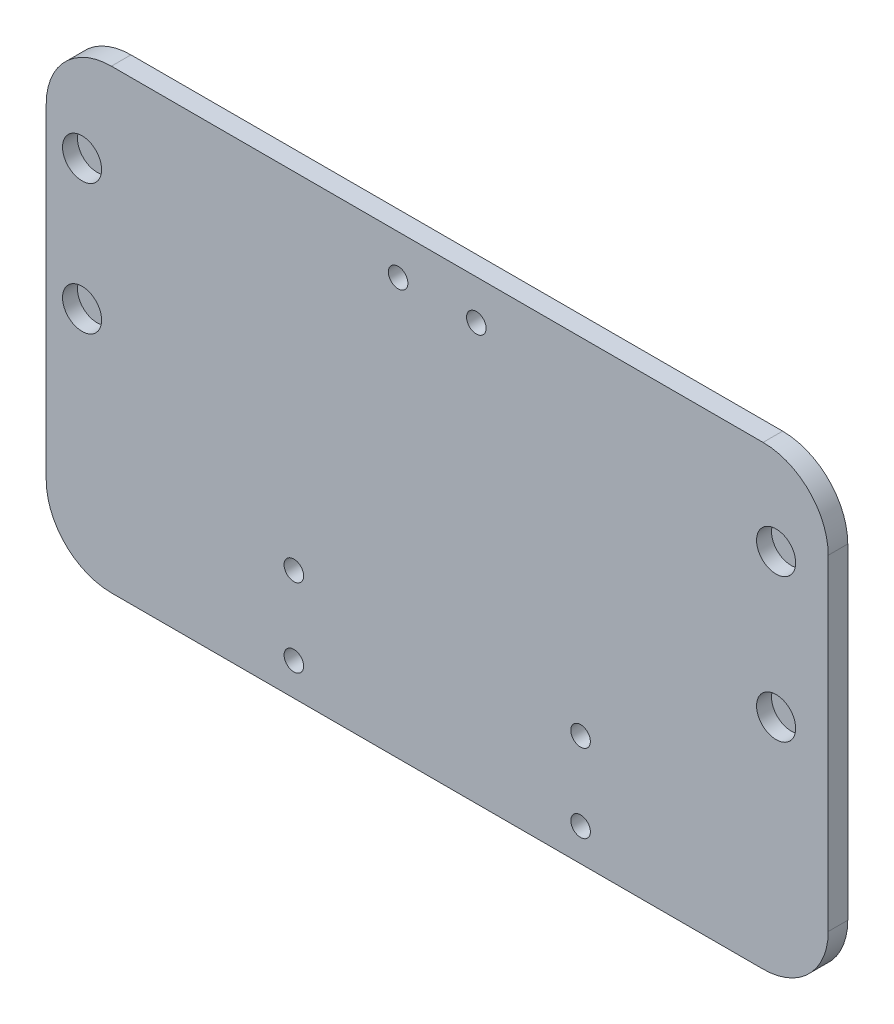
ISO-10303-21;
HEADER;
FILE_DESCRIPTION(('STEP AP214'),'2;1');
FILE_NAME('part.step','',(''),(''),'','','');
FILE_SCHEMA(('AUTOMOTIVE_DESIGN { 1 0 10303 214 1 1 1 1 }'));
ENDSEC;
DATA;
#1=APPLICATION_CONTEXT('core data for automotive mechanical design processes');
#2=APPLICATION_PROTOCOL_DEFINITION('international standard','automotive_design',2000,#1);
#3=PRODUCT_CONTEXT('',#1,'mechanical');
#4=PRODUCT('Part','Part','',(#3));
#5=PRODUCT_RELATED_PRODUCT_CATEGORY('part','',(#4));
#6=PRODUCT_DEFINITION_FORMATION('','',#4);
#7=PRODUCT_DEFINITION_CONTEXT('part definition',#1,'design');
#8=PRODUCT_DEFINITION('design','',#6,#7);
#9=PRODUCT_DEFINITION_SHAPE('','',#8);
#10=(LENGTH_UNIT() NAMED_UNIT(*) SI_UNIT(.MILLI.,.METRE.));
#11=(NAMED_UNIT(*) PLANE_ANGLE_UNIT() SI_UNIT($,.RADIAN.));
#12=(NAMED_UNIT(*) SI_UNIT($,.STERADIAN.) SOLID_ANGLE_UNIT());
#13=UNCERTAINTY_MEASURE_WITH_UNIT(LENGTH_MEASURE(1.E-05),#10,'distance_accuracy_value','');
#14=(GEOMETRIC_REPRESENTATION_CONTEXT(3) GLOBAL_UNCERTAINTY_ASSIGNED_CONTEXT((#13)) GLOBAL_UNIT_ASSIGNED_CONTEXT((#10,
#11,#12)) REPRESENTATION_CONTEXT('',''));
#15=CARTESIAN_POINT('',(0.,0.,0.));
#16=DIRECTION('',(0.,0.,1.));
#17=DIRECTION('',(1.,0.,0.));
#18=AXIS2_PLACEMENT_3D('',#15,#16,#17);
#19=CARTESIAN_POINT('',(1.54506437768241,27.7038626609442,3.));
#20=DIRECTION('',(0.,0.,-1.));
#21=DIRECTION('',(-1.,0.,0.));
#22=AXIS2_PLACEMENT_3D('',#19,#20,#21);
#23=CYLINDRICAL_SURFACE('',#22,10.);
#24=CARTESIAN_POINT('',(1.54506437768241,27.7038626609442,0.));
#25=DIRECTION('',(0.,0.,1.));
#26=DIRECTION('',(-1.,0.,0.));
#27=AXIS2_PLACEMENT_3D('',#24,#25,#26);
#28=CIRCLE('',#27,10.);
#29=CARTESIAN_POINT('',(11.5450643776824,27.7038626609442,0.));
#30=VERTEX_POINT('',#29);
#31=CARTESIAN_POINT('',(1.54506437768241,37.7038626609442,0.));
#32=VERTEX_POINT('',#31);
#33=EDGE_CURVE('E129',#30,#32,#28,.T.);
#34=ORIENTED_EDGE('',*,*,#33,.T.);
#35=DIRECTION('',(0.,0.,-1.));
#36=VECTOR('',#35,1.);
#37=CARTESIAN_POINT('',(1.54506437768241,37.7038626609442,3.));
#38=LINE('',#37,#36);
#39=CARTESIAN_POINT('',(1.54506437768241,37.7038626609442,3.));
#40=VERTEX_POINT('',#39);
#41=EDGE_CURVE('E11',#40,#32,#38,.T.);
#42=ORIENTED_EDGE('',*,*,#41,.F.);
#43=CARTESIAN_POINT('',(1.54506437768241,27.7038626609442,3.));
#44=DIRECTION('',(0.,0.,1.));
#45=DIRECTION('',(-1.,0.,0.));
#46=AXIS2_PLACEMENT_3D('',#43,#44,#45);
#47=CIRCLE('',#46,10.);
#48=CARTESIAN_POINT('',(11.5450643776824,27.7038626609442,3.));
#49=VERTEX_POINT('',#48);
#50=EDGE_CURVE('E144',#49,#40,#47,.T.);
#51=ORIENTED_EDGE('',*,*,#50,.F.);
#52=DIRECTION('',(0.,0.,-1.));
#53=VECTOR('',#52,1.);
#54=CARTESIAN_POINT('',(11.5450643776824,27.7038626609442,3.));
#55=LINE('',#54,#53);
#56=EDGE_CURVE('E125',#49,#30,#55,.T.);
#57=ORIENTED_EDGE('',*,*,#56,.T.);
#58=EDGE_LOOP('',(#34,#42,#51,#57));
#59=FACE_BOUND('',#58,.T.);
#60=ADVANCED_FACE('F33',(#59),#23,.T.);
#61=CARTESIAN_POINT('',(-98.4549356223175,37.7038626609442,3.));
#62=DIRECTION('',(0.,-1.,0.));
#63=DIRECTION('',(1.,0.,0.));
#64=AXIS2_PLACEMENT_3D('',#61,#62,#63);
#65=PLANE('',#64);
#66=DIRECTION('',(-1.,0.,0.));
#67=VECTOR('',#66,1.);
#68=CARTESIAN_POINT('',(-98.4549356223175,37.7038626609442,0.));
#69=LINE('',#68,#67);
#70=CARTESIAN_POINT('',(-98.4549356223175,37.7038626609442,0.));
#71=VERTEX_POINT('',#70);
#72=EDGE_CURVE('E132',#32,#71,#69,.T.);
#73=ORIENTED_EDGE('',*,*,#72,.T.);
#74=DIRECTION('',(0.,0.,-1.));
#75=VECTOR('',#74,1.);
#76=CARTESIAN_POINT('',(-98.4549356223175,37.7038626609442,3.));
#77=LINE('',#76,#75);
#78=CARTESIAN_POINT('',(-98.4549356223175,37.7038626609442,3.));
#79=VERTEX_POINT('',#78);
#80=EDGE_CURVE('E41',#79,#71,#77,.T.);
#81=ORIENTED_EDGE('',*,*,#80,.F.);
#82=DIRECTION('',(-1.,0.,0.));
#83=VECTOR('',#82,1.);
#84=CARTESIAN_POINT('',(-98.4549356223175,37.7038626609442,3.));
#85=LINE('',#84,#83);
#86=EDGE_CURVE('E92',#40,#79,#85,.T.);
#87=ORIENTED_EDGE('',*,*,#86,.F.);
#88=ORIENTED_EDGE('',*,*,#41,.T.);
#89=EDGE_LOOP('',(#73,#81,#87,#88));
#90=FACE_BOUND('',#89,.T.);
#91=ADVANCED_FACE('F282',(#90),#65,.F.);
#92=CARTESIAN_POINT('',(-98.4549356223176,27.7038626609442,3.));
#93=DIRECTION('',(0.,0.,-1.));
#94=DIRECTION('',(-1.,0.,0.));
#95=AXIS2_PLACEMENT_3D('',#92,#93,#94);
#96=CYLINDRICAL_SURFACE('',#95,10.);
#97=CARTESIAN_POINT('',(-98.4549356223176,27.7038626609442,0.));
#98=DIRECTION('',(0.,0.,1.));
#99=DIRECTION('',(1.,0.,0.));
#100=AXIS2_PLACEMENT_3D('',#97,#98,#99);
#101=CIRCLE('',#100,10.);
#102=CARTESIAN_POINT('',(-108.454935622318,27.7038626609441,0.));
#103=VERTEX_POINT('',#102);
#104=EDGE_CURVE('E135',#71,#103,#101,.T.);
#105=ORIENTED_EDGE('',*,*,#104,.T.);
#106=DIRECTION('',(0.,0.,-1.));
#107=VECTOR('',#106,1.);
#108=CARTESIAN_POINT('',(-108.454935622318,27.7038626609441,3.));
#109=LINE('',#108,#107);
#110=CARTESIAN_POINT('',(-108.454935622318,27.7038626609441,3.));
#111=VERTEX_POINT('',#110);
#112=EDGE_CURVE('E151',#111,#103,#109,.T.);
#113=ORIENTED_EDGE('',*,*,#112,.F.);
#114=CARTESIAN_POINT('',(-98.4549356223176,27.7038626609442,3.));
#115=DIRECTION('',(0.,0.,1.));
#116=DIRECTION('',(1.,0.,0.));
#117=AXIS2_PLACEMENT_3D('',#114,#115,#116);
#118=CIRCLE('',#117,10.);
#119=EDGE_CURVE('E159',#79,#111,#118,.T.);
#120=ORIENTED_EDGE('',*,*,#119,.F.);
#121=ORIENTED_EDGE('',*,*,#80,.T.);
#122=EDGE_LOOP('',(#105,#113,#120,#121));
#123=FACE_BOUND('',#122,.T.);
#124=ADVANCED_FACE('F157',(#123),#96,.T.);
#125=CARTESIAN_POINT('',(-108.454935622318,27.7038626609441,3.));
#126=DIRECTION('',(1.,0.,0.));
#127=DIRECTION('',(0.,0.,-1.));
#128=AXIS2_PLACEMENT_3D('',#125,#126,#127);
#129=PLANE('',#128);
#130=DIRECTION('',(0.,-1.,0.));
#131=VECTOR('',#130,1.);
#132=CARTESIAN_POINT('',(-108.454935622318,27.7038626609441,0.));
#133=LINE('',#132,#131);
#134=CARTESIAN_POINT('',(-108.454935622318,-22.2961373390557,0.));
#135=VERTEX_POINT('',#134);
#136=EDGE_CURVE('E137',#103,#135,#133,.T.);
#137=ORIENTED_EDGE('',*,*,#136,.T.);
#138=DIRECTION('',(0.,0.,-1.));
#139=VECTOR('',#138,1.);
#140=CARTESIAN_POINT('',(-108.454935622318,-22.2961373390557,3.));
#141=LINE('',#140,#139);
#142=CARTESIAN_POINT('',(-108.454935622318,-22.2961373390557,3.));
#143=VERTEX_POINT('',#142);
#144=EDGE_CURVE('E148',#143,#135,#141,.T.);
#145=ORIENTED_EDGE('',*,*,#144,.F.);
#146=DIRECTION('',(0.,-1.,0.));
#147=VECTOR('',#146,1.);
#148=CARTESIAN_POINT('',(-108.454935622318,27.7038626609441,3.));
#149=LINE('',#148,#147);
#150=EDGE_CURVE('E171',#111,#143,#149,.T.);
#151=ORIENTED_EDGE('',*,*,#150,.F.);
#152=ORIENTED_EDGE('',*,*,#112,.T.);
#153=EDGE_LOOP('',(#137,#145,#151,#152));
#154=FACE_BOUND('',#153,.T.);
#155=ADVANCED_FACE('F167',(#154),#129,.F.);
#156=CARTESIAN_POINT('',(-98.4549356223176,-22.2961373390558,3.));
#157=DIRECTION('',(0.,0.,-1.));
#158=DIRECTION('',(-1.,0.,0.));
#159=AXIS2_PLACEMENT_3D('',#156,#157,#158);
#160=CYLINDRICAL_SURFACE('',#159,10.);
#161=CARTESIAN_POINT('',(-98.4549356223176,-22.2961373390558,0.));
#162=DIRECTION('',(0.,0.,1.));
#163=DIRECTION('',(1.,0.,0.));
#164=AXIS2_PLACEMENT_3D('',#161,#162,#163);
#165=CIRCLE('',#164,10.);
#166=CARTESIAN_POINT('',(-98.4549356223175,-32.2961373390558,0.));
#167=VERTEX_POINT('',#166);
#168=EDGE_CURVE('E139',#135,#167,#165,.T.);
#169=ORIENTED_EDGE('',*,*,#168,.T.);
#170=DIRECTION('',(0.,0.,-1.));
#171=VECTOR('',#170,1.);
#172=CARTESIAN_POINT('',(-98.4549356223175,-32.2961373390558,3.));
#173=LINE('',#172,#171);
#174=CARTESIAN_POINT('',(-98.4549356223175,-32.2961373390558,3.));
#175=VERTEX_POINT('',#174);
#176=EDGE_CURVE('E120',#175,#167,#173,.T.);
#177=ORIENTED_EDGE('',*,*,#176,.F.);
#178=CARTESIAN_POINT('',(-98.4549356223176,-22.2961373390558,3.));
#179=DIRECTION('',(0.,0.,1.));
#180=DIRECTION('',(1.,0.,0.));
#181=AXIS2_PLACEMENT_3D('',#178,#179,#180);
#182=CIRCLE('',#181,10.);
#183=EDGE_CURVE('E111',#143,#175,#182,.T.);
#184=ORIENTED_EDGE('',*,*,#183,.F.);
#185=ORIENTED_EDGE('',*,*,#144,.T.);
#186=EDGE_LOOP('',(#169,#177,#184,#185));
#187=FACE_BOUND('',#186,.T.);
#188=ADVANCED_FACE('F170',(#187),#160,.T.);
#189=CARTESIAN_POINT('',(-98.4549356223175,-32.2961373390558,3.));
#190=DIRECTION('',(0.,1.,0.));
#191=DIRECTION('',(0.,0.,1.));
#192=AXIS2_PLACEMENT_3D('',#189,#190,#191);
#193=PLANE('',#192);
#194=DIRECTION('',(1.,0.,0.));
#195=VECTOR('',#194,1.);
#196=CARTESIAN_POINT('',(-98.4549356223175,-32.2961373390558,0.));
#197=LINE('',#196,#195);
#198=CARTESIAN_POINT('',(1.54506437768241,-32.2961373390558,0.));
#199=VERTEX_POINT('',#198);
#200=EDGE_CURVE('E119',#167,#199,#197,.T.);
#201=ORIENTED_EDGE('',*,*,#200,.T.);
#202=DIRECTION('',(0.,0.,-1.));
#203=VECTOR('',#202,1.);
#204=CARTESIAN_POINT('',(1.54506437768241,-32.2961373390558,3.));
#205=LINE('',#204,#203);
#206=CARTESIAN_POINT('',(1.54506437768241,-32.2961373390558,3.));
#207=VERTEX_POINT('',#206);
#208=EDGE_CURVE('E116',#207,#199,#205,.T.);
#209=ORIENTED_EDGE('',*,*,#208,.F.);
#210=DIRECTION('',(1.,0.,0.));
#211=VECTOR('',#210,1.);
#212=CARTESIAN_POINT('',(-98.4549356223175,-32.2961373390558,3.));
#213=LINE('',#212,#211);
#214=EDGE_CURVE('E105',#175,#207,#213,.T.);
#215=ORIENTED_EDGE('',*,*,#214,.F.);
#216=ORIENTED_EDGE('',*,*,#176,.T.);
#217=EDGE_LOOP('',(#201,#209,#215,#216));
#218=FACE_BOUND('',#217,.T.);
#219=ADVANCED_FACE('F117',(#218),#193,.F.);
#220=CARTESIAN_POINT('',(1.54506437768241,-22.2961373390558,3.));
#221=DIRECTION('',(0.,0.,-1.));
#222=DIRECTION('',(-1.,0.,0.));
#223=AXIS2_PLACEMENT_3D('',#220,#221,#222);
#224=CYLINDRICAL_SURFACE('',#223,10.);
#225=CARTESIAN_POINT('',(1.54506437768241,-22.2961373390558,0.));
#226=DIRECTION('',(0.,0.,1.));
#227=DIRECTION('',(1.,0.,0.));
#228=AXIS2_PLACEMENT_3D('',#225,#226,#227);
#229=CIRCLE('',#228,10.);
#230=CARTESIAN_POINT('',(11.5450643776824,-22.2961373390558,0.));
#231=VERTEX_POINT('',#230);
#232=EDGE_CURVE('E78',#199,#231,#229,.T.);
#233=ORIENTED_EDGE('',*,*,#232,.T.);
#234=DIRECTION('',(0.,0.,-1.));
#235=VECTOR('',#234,1.);
#236=CARTESIAN_POINT('',(11.5450643776824,-22.2961373390558,3.));
#237=LINE('',#236,#235);
#238=CARTESIAN_POINT('',(11.5450643776824,-22.2961373390558,3.));
#239=VERTEX_POINT('',#238);
#240=EDGE_CURVE('E121',#239,#231,#237,.T.);
#241=ORIENTED_EDGE('',*,*,#240,.F.);
#242=CARTESIAN_POINT('',(1.54506437768241,-22.2961373390558,3.));
#243=DIRECTION('',(0.,0.,1.));
#244=DIRECTION('',(1.,0.,0.));
#245=AXIS2_PLACEMENT_3D('',#242,#243,#244);
#246=CIRCLE('',#245,10.);
#247=EDGE_CURVE('E109',#207,#239,#246,.T.);
#248=ORIENTED_EDGE('',*,*,#247,.F.);
#249=ORIENTED_EDGE('',*,*,#208,.T.);
#250=EDGE_LOOP('',(#233,#241,#248,#249));
#251=FACE_BOUND('',#250,.T.);
#252=ADVANCED_FACE('F123',(#251),#224,.T.);
#253=CARTESIAN_POINT('',(11.5450643776824,27.7038626609442,3.));
#254=DIRECTION('',(-1.,0.,0.));
#255=DIRECTION('',(0.,-1.,0.));
#256=AXIS2_PLACEMENT_3D('',#253,#254,#255);
#257=PLANE('',#256);
#258=DIRECTION('',(0.,1.,0.));
#259=VECTOR('',#258,1.);
#260=CARTESIAN_POINT('',(11.5450643776824,27.7038626609442,0.));
#261=LINE('',#260,#259);
#262=EDGE_CURVE('E84',#231,#30,#261,.T.);
#263=ORIENTED_EDGE('',*,*,#262,.T.);
#264=ORIENTED_EDGE('',*,*,#56,.F.);
#265=DIRECTION('',(0.,1.,0.));
#266=VECTOR('',#265,1.);
#267=CARTESIAN_POINT('',(11.5450643776824,27.7038626609442,3.));
#268=LINE('',#267,#266);
#269=EDGE_CURVE('E49',#239,#49,#268,.T.);
#270=ORIENTED_EDGE('',*,*,#269,.F.);
#271=ORIENTED_EDGE('',*,*,#240,.T.);
#272=EDGE_LOOP('',(#263,#264,#270,#271));
#273=FACE_BOUND('',#272,.T.);
#274=ADVANCED_FACE('F248',(#273),#257,.F.);
#275=CARTESIAN_POINT('',(1.54506437768241,27.7038626609442,3.));
#276=DIRECTION('',(0.,0.,-1.));
#277=DIRECTION('',(-1.,0.,0.));
#278=AXIS2_PLACEMENT_3D('',#275,#276,#277);
#279=PLANE('',#278);
#280=CARTESIAN_POINT('',(-102.954935622318,3.20386266094422,3.));
#281=DIRECTION('',(0.,0.,1.));
#282=DIRECTION('',(1.,0.,0.));
#283=AXIS2_PLACEMENT_3D('',#280,#281,#282);
#284=CIRCLE('',#283,3.00000000000001);
#285=CARTESIAN_POINT('',(-99.9549356223176,3.20386266094422,3.));
#286=VERTEX_POINT('',#285);
#287=EDGE_CURVE('E226',#286,#286,#284,.T.);
#288=ORIENTED_EDGE('',*,*,#287,.F.);
#289=EDGE_LOOP('',(#288));
#290=FACE_BOUND('',#289,.T.);
#291=CARTESIAN_POINT('',(3.54506437768241,24.2038626609442,3.));
#292=DIRECTION('',(0.,0.,1.));
#293=DIRECTION('',(1.,0.,0.));
#294=AXIS2_PLACEMENT_3D('',#291,#292,#293);
#295=CIRCLE('',#294,3.);
#296=CARTESIAN_POINT('',(6.54506437768242,24.2038626609442,3.));
#297=VERTEX_POINT('',#296);
#298=EDGE_CURVE('E219',#297,#297,#295,.T.);
#299=ORIENTED_EDGE('',*,*,#298,.F.);
#300=EDGE_LOOP('',(#299));
#301=FACE_BOUND('',#300,.T.);
#302=CARTESIAN_POINT('',(3.54506437768241,2.20386266094422,3.));
#303=DIRECTION('',(0.,0.,1.));
#304=DIRECTION('',(1.,0.,0.));
#305=AXIS2_PLACEMENT_3D('',#302,#303,#304);
#306=CIRCLE('',#305,3.);
#307=CARTESIAN_POINT('',(6.54506437768242,2.20386266094422,3.));
#308=VERTEX_POINT('',#307);
#309=EDGE_CURVE('E231',#308,#308,#306,.T.);
#310=ORIENTED_EDGE('',*,*,#309,.F.);
#311=EDGE_LOOP('',(#310));
#312=FACE_BOUND('',#311,.T.);
#313=CARTESIAN_POINT('',(-102.954935622318,23.2038626609442,3.));
#314=DIRECTION('',(0.,0.,1.));
#315=DIRECTION('',(1.,0.,0.));
#316=AXIS2_PLACEMENT_3D('',#313,#314,#315);
#317=CIRCLE('',#316,3.00000000000001);
#318=CARTESIAN_POINT('',(-99.9549356223176,23.2038626609442,3.));
#319=VERTEX_POINT('',#318);
#320=EDGE_CURVE('E213',#319,#319,#317,.T.);
#321=ORIENTED_EDGE('',*,*,#320,.F.);
#322=EDGE_LOOP('',(#321));
#323=FACE_BOUND('',#322,.T.);
#324=CARTESIAN_POINT('',(-26.4549356223176,-15.2961373390558,3.));
#325=DIRECTION('',(0.,0.,1.));
#326=DIRECTION('',(1.,0.,0.));
#327=AXIS2_PLACEMENT_3D('',#324,#325,#326);
#328=CIRCLE('',#327,1.5);
#329=CARTESIAN_POINT('',(-24.9549356223176,-15.2961373390558,3.));
#330=VERTEX_POINT('',#329);
#331=EDGE_CURVE('E195',#330,#330,#328,.T.);
#332=ORIENTED_EDGE('',*,*,#331,.F.);
#333=EDGE_LOOP('',(#332));
#334=FACE_BOUND('',#333,.T.);
#335=CARTESIAN_POINT('',(-70.4549356223176,-27.2961373390558,3.));
#336=DIRECTION('',(0.,0.,1.));
#337=DIRECTION('',(1.,0.,0.));
#338=AXIS2_PLACEMENT_3D('',#335,#336,#337);
#339=CIRCLE('',#338,1.5);
#340=CARTESIAN_POINT('',(-68.9549356223176,-27.2961373390558,3.));
#341=VERTEX_POINT('',#340);
#342=EDGE_CURVE('E202',#341,#341,#339,.T.);
#343=ORIENTED_EDGE('',*,*,#342,.F.);
#344=EDGE_LOOP('',(#343));
#345=FACE_BOUND('',#344,.T.);
#346=CARTESIAN_POINT('',(-70.4549356223176,-15.2961373390558,3.));
#347=DIRECTION('',(0.,0.,1.));
#348=DIRECTION('',(1.,0.,0.));
#349=AXIS2_PLACEMENT_3D('',#346,#347,#348);
#350=CIRCLE('',#349,1.5);
#351=CARTESIAN_POINT('',(-68.9549356223176,-15.2961373390558,3.));
#352=VERTEX_POINT('',#351);
#353=EDGE_CURVE('E183',#352,#352,#350,.T.);
#354=ORIENTED_EDGE('',*,*,#353,.F.);
#355=EDGE_LOOP('',(#354));
#356=FACE_BOUND('',#355,.T.);
#357=CARTESIAN_POINT('',(-42.4549356223176,31.6065740698624,3.));
#358=DIRECTION('',(0.,0.,1.));
#359=DIRECTION('',(1.,0.,0.));
#360=AXIS2_PLACEMENT_3D('',#357,#358,#359);
#361=CIRCLE('',#360,1.5);
#362=CARTESIAN_POINT('',(-40.9549356223176,31.6065740698624,3.));
#363=VERTEX_POINT('',#362);
#364=EDGE_CURVE('E190',#363,#363,#361,.T.);
#365=ORIENTED_EDGE('',*,*,#364,.F.);
#366=EDGE_LOOP('',(#365));
#367=FACE_BOUND('',#366,.T.);
#368=CARTESIAN_POINT('',(-26.4549356223176,-27.2961373390558,3.));
#369=DIRECTION('',(0.,0.,1.));
#370=DIRECTION('',(1.,0.,0.));
#371=AXIS2_PLACEMENT_3D('',#368,#369,#370);
#372=CIRCLE('',#371,1.5);
#373=CARTESIAN_POINT('',(-24.9549356223176,-27.2961373390558,3.));
#374=VERTEX_POINT('',#373);
#375=EDGE_CURVE('E207',#374,#374,#372,.T.);
#376=ORIENTED_EDGE('',*,*,#375,.F.);
#377=EDGE_LOOP('',(#376));
#378=FACE_BOUND('',#377,.T.);
#379=CARTESIAN_POINT('',(-54.4549356223176,31.6065740698624,3.));
#380=DIRECTION('',(0.,0.,1.));
#381=DIRECTION('',(1.,0.,0.));
#382=AXIS2_PLACEMENT_3D('',#379,#380,#381);
#383=CIRCLE('',#382,1.5);
#384=CARTESIAN_POINT('',(-52.9549356223176,31.6065740698624,3.));
#385=VERTEX_POINT('',#384);
#386=EDGE_CURVE('E177',#385,#385,#383,.T.);
#387=ORIENTED_EDGE('',*,*,#386,.F.);
#388=EDGE_LOOP('',(#387));
#389=FACE_BOUND('',#388,.T.);
#390=ORIENTED_EDGE('',*,*,#50,.T.);
#391=ORIENTED_EDGE('',*,*,#86,.T.);
#392=ORIENTED_EDGE('',*,*,#119,.T.);
#393=ORIENTED_EDGE('',*,*,#150,.T.);
#394=ORIENTED_EDGE('',*,*,#183,.T.);
#395=ORIENTED_EDGE('',*,*,#214,.T.);
#396=ORIENTED_EDGE('',*,*,#247,.T.);
#397=ORIENTED_EDGE('',*,*,#269,.T.);
#398=EDGE_LOOP('',(#390,#391,#392,#393,#394,#395,#396,#397));
#399=FACE_BOUND('',#398,.T.);
#400=ADVANCED_FACE('F107',(#290,#301,#312,#323,#334,#345,#356,#367,#378,#389,#399),#279,.F.);
#401=CARTESIAN_POINT('',(1.54506437768241,27.7038626609442,0.));
#402=DIRECTION('',(0.,0.,-1.));
#403=DIRECTION('',(-1.,0.,0.));
#404=AXIS2_PLACEMENT_3D('',#401,#402,#403);
#405=PLANE('',#404);
#406=CARTESIAN_POINT('',(-26.4549356223176,-15.2961373390558,0.));
#407=DIRECTION('',(0.,0.,1.));
#408=DIRECTION('',(1.,0.,0.));
#409=AXIS2_PLACEMENT_3D('',#406,#407,#408);
#410=CIRCLE('',#409,1.5);
#411=CARTESIAN_POINT('',(-24.9549356223176,-15.2961373390558,0.));
#412=VERTEX_POINT('',#411);
#413=EDGE_CURVE('E198',#412,#412,#410,.T.);
#414=ORIENTED_EDGE('',*,*,#413,.T.);
#415=EDGE_LOOP('',(#414));
#416=FACE_BOUND('',#415,.T.);
#417=CARTESIAN_POINT('',(-70.4549356223176,-27.2961373390558,0.));
#418=DIRECTION('',(0.,0.,1.));
#419=DIRECTION('',(1.,0.,0.));
#420=AXIS2_PLACEMENT_3D('',#417,#418,#419);
#421=CIRCLE('',#420,1.5);
#422=CARTESIAN_POINT('',(-68.9549356223176,-27.2961373390558,0.));
#423=VERTEX_POINT('',#422);
#424=EDGE_CURVE('E187',#423,#423,#421,.T.);
#425=ORIENTED_EDGE('',*,*,#424,.T.);
#426=EDGE_LOOP('',(#425));
#427=FACE_BOUND('',#426,.T.);
#428=CARTESIAN_POINT('',(-70.4549356223176,-15.2961373390558,0.));
#429=DIRECTION('',(0.,0.,1.));
#430=DIRECTION('',(1.,0.,0.));
#431=AXIS2_PLACEMENT_3D('',#428,#429,#430);
#432=CIRCLE('',#431,1.5);
#433=CARTESIAN_POINT('',(-68.9549356223176,-15.2961373390558,0.));
#434=VERTEX_POINT('',#433);
#435=EDGE_CURVE('E186',#434,#434,#432,.T.);
#436=ORIENTED_EDGE('',*,*,#435,.T.);
#437=EDGE_LOOP('',(#436));
#438=FACE_BOUND('',#437,.T.);
#439=CARTESIAN_POINT('',(-42.4549356223176,31.6065740698624,0.));
#440=DIRECTION('',(0.,0.,1.));
#441=DIRECTION('',(1.,0.,0.));
#442=AXIS2_PLACEMENT_3D('',#439,#440,#441);
#443=CIRCLE('',#442,1.5);
#444=CARTESIAN_POINT('',(-40.9549356223176,31.6065740698624,0.));
#445=VERTEX_POINT('',#444);
#446=EDGE_CURVE('E180',#445,#445,#443,.T.);
#447=ORIENTED_EDGE('',*,*,#446,.T.);
#448=EDGE_LOOP('',(#447));
#449=FACE_BOUND('',#448,.T.);
#450=CARTESIAN_POINT('',(-26.4549356223176,-27.2961373390558,0.));
#451=DIRECTION('',(0.,0.,1.));
#452=DIRECTION('',(1.,0.,0.));
#453=AXIS2_PLACEMENT_3D('',#450,#451,#452);
#454=CIRCLE('',#453,1.5);
#455=CARTESIAN_POINT('',(-24.9549356223176,-27.2961373390558,0.));
#456=VERTEX_POINT('',#455);
#457=EDGE_CURVE('E199',#456,#456,#454,.T.);
#458=ORIENTED_EDGE('',*,*,#457,.T.);
#459=EDGE_LOOP('',(#458));
#460=FACE_BOUND('',#459,.T.);
#461=CARTESIAN_POINT('',(-54.4549356223176,31.6065740698624,0.));
#462=DIRECTION('',(0.,0.,1.));
#463=DIRECTION('',(1.,0.,0.));
#464=AXIS2_PLACEMENT_3D('',#461,#462,#463);
#465=CIRCLE('',#464,1.5);
#466=CARTESIAN_POINT('',(-52.9549356223176,31.6065740698624,0.));
#467=VERTEX_POINT('',#466);
#468=EDGE_CURVE('E133',#467,#467,#465,.T.);
#469=ORIENTED_EDGE('',*,*,#468,.T.);
#470=EDGE_LOOP('',(#469));
#471=FACE_BOUND('',#470,.T.);
#472=ORIENTED_EDGE('',*,*,#33,.F.);
#473=ORIENTED_EDGE('',*,*,#262,.F.);
#474=ORIENTED_EDGE('',*,*,#232,.F.);
#475=ORIENTED_EDGE('',*,*,#200,.F.);
#476=ORIENTED_EDGE('',*,*,#168,.F.);
#477=ORIENTED_EDGE('',*,*,#136,.F.);
#478=ORIENTED_EDGE('',*,*,#104,.F.);
#479=ORIENTED_EDGE('',*,*,#72,.F.);
#480=EDGE_LOOP('',(#472,#473,#474,#475,#476,#477,#478,#479));
#481=FACE_BOUND('',#480,.T.);
#482=ADVANCED_FACE('F163',(#416,#427,#438,#449,#460,#471,#481),#405,.T.);
#483=CARTESIAN_POINT('',(-54.4549356223176,31.6065740698624,0.));
#484=DIRECTION('',(0.,0.,1.));
#485=DIRECTION('',(1.,0.,0.));
#486=AXIS2_PLACEMENT_3D('',#483,#484,#485);
#487=CYLINDRICAL_SURFACE('',#486,1.5);
#488=ORIENTED_EDGE('',*,*,#468,.F.);
#489=EDGE_LOOP('',(#488));
#490=FACE_BOUND('',#489,.T.);
#491=ORIENTED_EDGE('',*,*,#386,.T.);
#492=EDGE_LOOP('',(#491));
#493=FACE_BOUND('',#492,.T.);
#494=ADVANCED_FACE('F265',(#490,#493),#487,.F.);
#495=CARTESIAN_POINT('',(-26.4549356223176,-27.2961373390558,0.));
#496=DIRECTION('',(0.,0.,1.));
#497=DIRECTION('',(1.,0.,0.));
#498=AXIS2_PLACEMENT_3D('',#495,#496,#497);
#499=CYLINDRICAL_SURFACE('',#498,1.5);
#500=ORIENTED_EDGE('',*,*,#457,.F.);
#501=EDGE_LOOP('',(#500));
#502=FACE_BOUND('',#501,.T.);
#503=ORIENTED_EDGE('',*,*,#375,.T.);
#504=EDGE_LOOP('',(#503));
#505=FACE_BOUND('',#504,.T.);
#506=ADVANCED_FACE('F267',(#502,#505),#499,.F.);
#507=CARTESIAN_POINT('',(-42.4549356223176,31.6065740698624,0.));
#508=DIRECTION('',(0.,0.,1.));
#509=DIRECTION('',(1.,0.,0.));
#510=AXIS2_PLACEMENT_3D('',#507,#508,#509);
#511=CYLINDRICAL_SURFACE('',#510,1.5);
#512=ORIENTED_EDGE('',*,*,#446,.F.);
#513=EDGE_LOOP('',(#512));
#514=FACE_BOUND('',#513,.T.);
#515=ORIENTED_EDGE('',*,*,#364,.T.);
#516=EDGE_LOOP('',(#515));
#517=FACE_BOUND('',#516,.T.);
#518=ADVANCED_FACE('F274',(#514,#517),#511,.F.);
#519=CARTESIAN_POINT('',(-70.4549356223176,-15.2961373390558,0.));
#520=DIRECTION('',(0.,0.,1.));
#521=DIRECTION('',(1.,0.,0.));
#522=AXIS2_PLACEMENT_3D('',#519,#520,#521);
#523=CYLINDRICAL_SURFACE('',#522,1.5);
#524=ORIENTED_EDGE('',*,*,#435,.F.);
#525=EDGE_LOOP('',(#524));
#526=FACE_BOUND('',#525,.T.);
#527=ORIENTED_EDGE('',*,*,#353,.T.);
#528=EDGE_LOOP('',(#527));
#529=FACE_BOUND('',#528,.T.);
#530=ADVANCED_FACE('F353',(#526,#529),#523,.F.);
#531=CARTESIAN_POINT('',(-70.4549356223176,-27.2961373390558,0.));
#532=DIRECTION('',(0.,0.,1.));
#533=DIRECTION('',(1.,0.,0.));
#534=AXIS2_PLACEMENT_3D('',#531,#532,#533);
#535=CYLINDRICAL_SURFACE('',#534,1.5);
#536=ORIENTED_EDGE('',*,*,#424,.F.);
#537=EDGE_LOOP('',(#536));
#538=FACE_BOUND('',#537,.T.);
#539=ORIENTED_EDGE('',*,*,#342,.T.);
#540=EDGE_LOOP('',(#539));
#541=FACE_BOUND('',#540,.T.);
#542=ADVANCED_FACE('F363',(#538,#541),#535,.F.);
#543=CARTESIAN_POINT('',(-26.4549356223176,-15.2961373390558,0.));
#544=DIRECTION('',(0.,0.,1.));
#545=DIRECTION('',(1.,0.,0.));
#546=AXIS2_PLACEMENT_3D('',#543,#544,#545);
#547=CYLINDRICAL_SURFACE('',#546,1.5);
#548=ORIENTED_EDGE('',*,*,#413,.F.);
#549=EDGE_LOOP('',(#548));
#550=FACE_BOUND('',#549,.T.);
#551=ORIENTED_EDGE('',*,*,#331,.T.);
#552=EDGE_LOOP('',(#551));
#553=FACE_BOUND('',#552,.T.);
#554=ADVANCED_FACE('F372',(#550,#553),#547,.F.);
#555=CARTESIAN_POINT('',(-102.954935622318,23.2038626609442,0.7));
#556=DIRECTION('',(0.,0.,1.));
#557=DIRECTION('',(1.,0.,0.));
#558=AXIS2_PLACEMENT_3D('',#555,#556,#557);
#559=CYLINDRICAL_SURFACE('',#558,3.00000000000001);
#560=CARTESIAN_POINT('',(-102.954935622318,23.2038626609442,0.7));
#561=DIRECTION('',(0.,0.,1.));
#562=DIRECTION('',(1.,0.,0.));
#563=AXIS2_PLACEMENT_3D('',#560,#561,#562);
#564=CIRCLE('',#563,3.00000000000001);
#565=CARTESIAN_POINT('',(-99.9549356223176,23.2038626609442,0.7));
#566=VERTEX_POINT('',#565);
#567=EDGE_CURVE('E210',#566,#566,#564,.T.);
#568=ORIENTED_EDGE('',*,*,#567,.F.);
#569=EDGE_LOOP('',(#568));
#570=FACE_BOUND('',#569,.T.);
#571=ORIENTED_EDGE('',*,*,#320,.T.);
#572=EDGE_LOOP('',(#571));
#573=FACE_BOUND('',#572,.T.);
#574=ADVANCED_FACE('F382',(#570,#573),#559,.F.);
#575=CARTESIAN_POINT('',(-102.954935622318,23.2038626609442,0.7));
#576=DIRECTION('',(0.,0.,1.));
#577=DIRECTION('',(1.,0.,0.));
#578=AXIS2_PLACEMENT_3D('',#575,#576,#577);
#579=PLANE('',#578);
#580=ORIENTED_EDGE('',*,*,#567,.T.);
#581=EDGE_LOOP('',(#580));
#582=FACE_BOUND('',#581,.T.);
#583=ADVANCED_FACE('F242',(#582),#579,.T.);
#584=CARTESIAN_POINT('',(3.54506437768241,2.20386266094422,0.7));
#585=DIRECTION('',(0.,0.,1.));
#586=DIRECTION('',(1.,0.,0.));
#587=AXIS2_PLACEMENT_3D('',#584,#585,#586);
#588=CYLINDRICAL_SURFACE('',#587,3.);
#589=CARTESIAN_POINT('',(3.54506437768241,2.20386266094422,0.7));
#590=DIRECTION('',(0.,0.,1.));
#591=DIRECTION('',(1.,0.,0.));
#592=AXIS2_PLACEMENT_3D('',#589,#590,#591);
#593=CIRCLE('',#592,3.);
#594=CARTESIAN_POINT('',(6.54506437768242,2.20386266094422,0.7));
#595=VERTEX_POINT('',#594);
#596=EDGE_CURVE('E223',#595,#595,#593,.T.);
#597=ORIENTED_EDGE('',*,*,#596,.F.);
#598=EDGE_LOOP('',(#597));
#599=FACE_BOUND('',#598,.T.);
#600=ORIENTED_EDGE('',*,*,#309,.T.);
#601=EDGE_LOOP('',(#600));
#602=FACE_BOUND('',#601,.T.);
#603=ADVANCED_FACE('F239',(#599,#602),#588,.F.);
#604=CARTESIAN_POINT('',(3.54506437768241,2.20386266094422,0.7));
#605=DIRECTION('',(0.,0.,1.));
#606=DIRECTION('',(1.,0.,0.));
#607=AXIS2_PLACEMENT_3D('',#604,#605,#606);
#608=PLANE('',#607);
#609=ORIENTED_EDGE('',*,*,#596,.T.);
#610=EDGE_LOOP('',(#609));
#611=FACE_BOUND('',#610,.T.);
#612=ADVANCED_FACE('F237',(#611),#608,.T.);
#613=CARTESIAN_POINT('',(3.54506437768241,24.2038626609442,0.7));
#614=DIRECTION('',(0.,0.,1.));
#615=DIRECTION('',(1.,0.,0.));
#616=AXIS2_PLACEMENT_3D('',#613,#614,#615);
#617=CYLINDRICAL_SURFACE('',#616,3.);
#618=CARTESIAN_POINT('',(3.54506437768241,24.2038626609442,0.7));
#619=DIRECTION('',(0.,0.,1.));
#620=DIRECTION('',(1.,0.,0.));
#621=AXIS2_PLACEMENT_3D('',#618,#619,#620);
#622=CIRCLE('',#621,3.);
#623=CARTESIAN_POINT('',(6.54506437768242,24.2038626609442,0.7));
#624=VERTEX_POINT('',#623);
#625=EDGE_CURVE('E222',#624,#624,#622,.T.);
#626=ORIENTED_EDGE('',*,*,#625,.F.);
#627=EDGE_LOOP('',(#626));
#628=FACE_BOUND('',#627,.T.);
#629=ORIENTED_EDGE('',*,*,#298,.T.);
#630=EDGE_LOOP('',(#629));
#631=FACE_BOUND('',#630,.T.);
#632=ADVANCED_FACE('F421',(#628,#631),#617,.F.);
#633=CARTESIAN_POINT('',(3.54506437768241,24.2038626609442,0.7));
#634=DIRECTION('',(0.,0.,1.));
#635=DIRECTION('',(1.,0.,0.));
#636=AXIS2_PLACEMENT_3D('',#633,#634,#635);
#637=PLANE('',#636);
#638=ORIENTED_EDGE('',*,*,#625,.T.);
#639=EDGE_LOOP('',(#638));
#640=FACE_BOUND('',#639,.T.);
#641=ADVANCED_FACE('F430',(#640),#637,.T.);
#642=CARTESIAN_POINT('',(-102.954935622318,3.20386266094422,0.7));
#643=DIRECTION('',(0.,0.,1.));
#644=DIRECTION('',(1.,0.,0.));
#645=AXIS2_PLACEMENT_3D('',#642,#643,#644);
#646=CYLINDRICAL_SURFACE('',#645,3.00000000000001);
#647=CARTESIAN_POINT('',(-102.954935622318,3.20386266094422,0.7));
#648=DIRECTION('',(0.,0.,1.));
#649=DIRECTION('',(1.,0.,0.));
#650=AXIS2_PLACEMENT_3D('',#647,#648,#649);
#651=CIRCLE('',#650,3.00000000000001);
#652=CARTESIAN_POINT('',(-99.9549356223176,3.20386266094422,0.7));
#653=VERTEX_POINT('',#652);
#654=EDGE_CURVE('E216',#653,#653,#651,.T.);
#655=ORIENTED_EDGE('',*,*,#654,.F.);
#656=EDGE_LOOP('',(#655));
#657=FACE_BOUND('',#656,.T.);
#658=ORIENTED_EDGE('',*,*,#287,.T.);
#659=EDGE_LOOP('',(#658));
#660=FACE_BOUND('',#659,.T.);
#661=ADVANCED_FACE('F440',(#657,#660),#646,.F.);
#662=CARTESIAN_POINT('',(-102.954935622318,3.20386266094422,0.7));
#663=DIRECTION('',(0.,0.,1.));
#664=DIRECTION('',(1.,0.,0.));
#665=AXIS2_PLACEMENT_3D('',#662,#663,#664);
#666=PLANE('',#665);
#667=ORIENTED_EDGE('',*,*,#654,.T.);
#668=EDGE_LOOP('',(#667));
#669=FACE_BOUND('',#668,.T.);
#670=ADVANCED_FACE('F450',(#669),#666,.T.);
#671=CLOSED_SHELL('',(#60,#91,#124,#155,#188,#219,#252,#274,#400,#482,#494,#506,#518,#530,#542,
#554,#574,#583,#603,#612,#632,#641,#661,#670));
#672=MANIFOLD_SOLID_BREP('B2',#671);
#673=ADVANCED_BREP_SHAPE_REPRESENTATION('',(#18,#672),#14);
#674=SHAPE_DEFINITION_REPRESENTATION(#9,#673);
ENDSEC;
END-ISO-10303-21;
